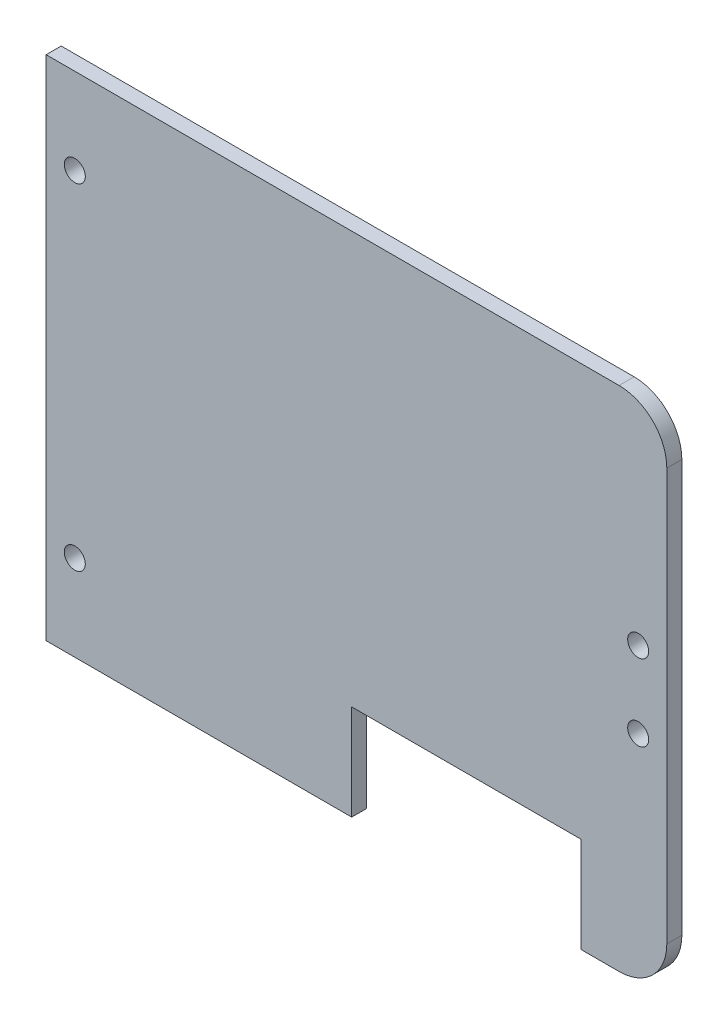
ISO-10303-21;
HEADER;
FILE_DESCRIPTION(('STEP AP214'),'2;1');
FILE_NAME('part.step','',(''),(''),'','','');
FILE_SCHEMA(('AUTOMOTIVE_DESIGN { 1 0 10303 214 1 1 1 1 }'));
ENDSEC;
DATA;
#1=APPLICATION_CONTEXT('core data for automotive mechanical design processes');
#2=APPLICATION_PROTOCOL_DEFINITION('international standard','automotive_design',2000,#1);
#3=PRODUCT_CONTEXT('',#1,'mechanical');
#4=PRODUCT('Part','Part','',(#3));
#5=PRODUCT_RELATED_PRODUCT_CATEGORY('part','',(#4));
#6=PRODUCT_DEFINITION_FORMATION('','',#4);
#7=PRODUCT_DEFINITION_CONTEXT('part definition',#1,'design');
#8=PRODUCT_DEFINITION('design','',#6,#7);
#9=PRODUCT_DEFINITION_SHAPE('','',#8);
#10=(LENGTH_UNIT() NAMED_UNIT(*) SI_UNIT(.MILLI.,.METRE.));
#11=(NAMED_UNIT(*) PLANE_ANGLE_UNIT() SI_UNIT($,.RADIAN.));
#12=(NAMED_UNIT(*) SI_UNIT($,.STERADIAN.) SOLID_ANGLE_UNIT());
#13=UNCERTAINTY_MEASURE_WITH_UNIT(LENGTH_MEASURE(1.E-05),#10,'distance_accuracy_value','');
#14=(GEOMETRIC_REPRESENTATION_CONTEXT(3) GLOBAL_UNCERTAINTY_ASSIGNED_CONTEXT((#13)) GLOBAL_UNIT_ASSIGNED_CONTEXT((#10,
#11,#12)) REPRESENTATION_CONTEXT('',''));
#15=CARTESIAN_POINT('',(0.,0.,0.));
#16=DIRECTION('',(0.,0.,1.));
#17=DIRECTION('',(1.,0.,0.));
#18=AXIS2_PLACEMENT_3D('',#15,#16,#17);
#19=CARTESIAN_POINT('',(60.,48.15,-1.5748));
#20=DIRECTION('',(0.,0.,1.));
#21=DIRECTION('',(1.,0.,0.));
#22=AXIS2_PLACEMENT_3D('',#19,#20,#21);
#23=CYLINDRICAL_SURFACE('',#22,5.);
#24=CARTESIAN_POINT('',(60.,48.15,0.));
#25=DIRECTION('',(0.,0.,1.));
#26=DIRECTION('',(1.,0.,0.));
#27=AXIS2_PLACEMENT_3D('',#24,#25,#26);
#28=CIRCLE('',#27,5.);
#29=CARTESIAN_POINT('',(65.,48.15,0.));
#30=VERTEX_POINT('',#29);
#31=CARTESIAN_POINT('',(60.,53.15,0.));
#32=VERTEX_POINT('',#31);
#33=EDGE_CURVE('E161',#30,#32,#28,.T.);
#34=ORIENTED_EDGE('',*,*,#33,.F.);
#35=DIRECTION('',(0.,0.,1.));
#36=VECTOR('',#35,1.);
#37=CARTESIAN_POINT('',(65.,48.15,-1.5748));
#38=LINE('',#37,#36);
#39=CARTESIAN_POINT('',(65.,48.15,-1.5748));
#40=VERTEX_POINT('',#39);
#41=EDGE_CURVE('E11',#40,#30,#38,.T.);
#42=ORIENTED_EDGE('',*,*,#41,.F.);
#43=CARTESIAN_POINT('',(60.,48.15,-1.5748));
#44=DIRECTION('',(0.,0.,1.));
#45=DIRECTION('',(1.,0.,0.));
#46=AXIS2_PLACEMENT_3D('',#43,#44,#45);
#47=CIRCLE('',#46,5.);
#48=CARTESIAN_POINT('',(60.,53.15,-1.5748));
#49=VERTEX_POINT('',#48);
#50=EDGE_CURVE('E197',#40,#49,#47,.T.);
#51=ORIENTED_EDGE('',*,*,#50,.T.);
#52=DIRECTION('',(0.,0.,1.));
#53=VECTOR('',#52,1.);
#54=CARTESIAN_POINT('',(60.,53.15,-1.5748));
#55=LINE('',#54,#53);
#56=EDGE_CURVE('E48',#49,#32,#55,.T.);
#57=ORIENTED_EDGE('',*,*,#56,.T.);
#58=EDGE_LOOP('',(#34,#42,#51,#57));
#59=FACE_BOUND('',#58,.T.);
#60=ADVANCED_FACE('F45',(#59),#23,.T.);
#61=CARTESIAN_POINT('',(65.,48.15,-1.5748));
#62=DIRECTION('',(1.,0.,0.));
#63=DIRECTION('',(0.,0.,-1.));
#64=AXIS2_PLACEMENT_3D('',#61,#62,#63);
#65=PLANE('',#64);
#66=DIRECTION('',(0.,1.,0.));
#67=VECTOR('',#66,1.);
#68=CARTESIAN_POINT('',(65.,48.15,0.));
#69=LINE('',#68,#67);
#70=CARTESIAN_POINT('',(65.,5.,0.));
#71=VERTEX_POINT('',#70);
#72=EDGE_CURVE('E194',#71,#30,#69,.T.);
#73=ORIENTED_EDGE('',*,*,#72,.F.);
#74=DIRECTION('',(0.,0.,1.));
#75=VECTOR('',#74,1.);
#76=CARTESIAN_POINT('',(65.,5.,-1.5748));
#77=LINE('',#76,#75);
#78=CARTESIAN_POINT('',(65.,5.,-1.5748));
#79=VERTEX_POINT('',#78);
#80=EDGE_CURVE('E55',#79,#71,#77,.T.);
#81=ORIENTED_EDGE('',*,*,#80,.F.);
#82=DIRECTION('',(0.,1.,0.));
#83=VECTOR('',#82,1.);
#84=CARTESIAN_POINT('',(65.,48.15,-1.5748));
#85=LINE('',#84,#83);
#86=EDGE_CURVE('E146',#79,#40,#85,.T.);
#87=ORIENTED_EDGE('',*,*,#86,.T.);
#88=ORIENTED_EDGE('',*,*,#41,.T.);
#89=EDGE_LOOP('',(#73,#81,#87,#88));
#90=FACE_BOUND('',#89,.T.);
#91=ADVANCED_FACE('F222',(#90),#65,.T.);
#92=CARTESIAN_POINT('',(60.,5.,-1.5748));
#93=DIRECTION('',(0.,0.,1.));
#94=DIRECTION('',(1.,0.,0.));
#95=AXIS2_PLACEMENT_3D('',#92,#93,#94);
#96=CYLINDRICAL_SURFACE('',#95,5.);
#97=CARTESIAN_POINT('',(60.,5.,0.));
#98=DIRECTION('',(0.,0.,1.));
#99=DIRECTION('',(1.,0.,0.));
#100=AXIS2_PLACEMENT_3D('',#97,#98,#99);
#101=CIRCLE('',#100,5.);
#102=CARTESIAN_POINT('',(60.,0.,0.));
#103=VERTEX_POINT('',#102);
#104=EDGE_CURVE('E132',#103,#71,#101,.T.);
#105=ORIENTED_EDGE('',*,*,#104,.F.);
#106=DIRECTION('',(0.,0.,1.));
#107=VECTOR('',#106,1.);
#108=CARTESIAN_POINT('',(60.,0.,-1.5748));
#109=LINE('',#108,#107);
#110=CARTESIAN_POINT('',(60.,0.,-1.5748));
#111=VERTEX_POINT('',#110);
#112=EDGE_CURVE('E127',#111,#103,#109,.T.);
#113=ORIENTED_EDGE('',*,*,#112,.F.);
#114=CARTESIAN_POINT('',(60.,5.,-1.5748));
#115=DIRECTION('',(0.,0.,1.));
#116=DIRECTION('',(1.,0.,0.));
#117=AXIS2_PLACEMENT_3D('',#114,#115,#116);
#118=CIRCLE('',#117,5.);
#119=EDGE_CURVE('E130',#111,#79,#118,.T.);
#120=ORIENTED_EDGE('',*,*,#119,.T.);
#121=ORIENTED_EDGE('',*,*,#80,.T.);
#122=EDGE_LOOP('',(#105,#113,#120,#121));
#123=FACE_BOUND('',#122,.T.);
#124=ADVANCED_FACE('F129',(#123),#96,.T.);
#125=CARTESIAN_POINT('',(60.,0.,-1.5748));
#126=DIRECTION('',(0.,-1.,0.));
#127=DIRECTION('',(0.,0.,-1.));
#128=AXIS2_PLACEMENT_3D('',#125,#126,#127);
#129=PLANE('',#128);
#130=DIRECTION('',(1.,0.,0.));
#131=VECTOR('',#130,1.);
#132=CARTESIAN_POINT('',(60.,0.,0.));
#133=LINE('',#132,#131);
#134=CARTESIAN_POINT('',(56.,0.,0.));
#135=VERTEX_POINT('',#134);
#136=EDGE_CURVE('E189',#135,#103,#133,.T.);
#137=ORIENTED_EDGE('',*,*,#136,.F.);
#138=DIRECTION('',(0.,0.,1.));
#139=VECTOR('',#138,1.);
#140=CARTESIAN_POINT('',(56.,0.,-1.5748));
#141=LINE('',#140,#139);
#142=CARTESIAN_POINT('',(56.,0.,-1.5748));
#143=VERTEX_POINT('',#142);
#144=EDGE_CURVE('E138',#143,#135,#141,.T.);
#145=ORIENTED_EDGE('',*,*,#144,.F.);
#146=DIRECTION('',(1.,0.,0.));
#147=VECTOR('',#146,1.);
#148=CARTESIAN_POINT('',(60.,0.,-1.5748));
#149=LINE('',#148,#147);
#150=EDGE_CURVE('E144',#143,#111,#149,.T.);
#151=ORIENTED_EDGE('',*,*,#150,.T.);
#152=ORIENTED_EDGE('',*,*,#112,.T.);
#153=EDGE_LOOP('',(#137,#145,#151,#152));
#154=FACE_BOUND('',#153,.T.);
#155=ADVANCED_FACE('F149',(#154),#129,.T.);
#156=CARTESIAN_POINT('',(56.,0.,-1.5748));
#157=DIRECTION('',(-1.,0.,0.));
#158=DIRECTION('',(0.,0.,1.));
#159=AXIS2_PLACEMENT_3D('',#156,#157,#158);
#160=PLANE('',#159);
#161=DIRECTION('',(0.,-1.,0.));
#162=VECTOR('',#161,1.);
#163=CARTESIAN_POINT('',(56.,0.,0.));
#164=LINE('',#163,#162);
#165=CARTESIAN_POINT('',(56.,10.,0.));
#166=VERTEX_POINT('',#165);
#167=EDGE_CURVE('E186',#166,#135,#164,.T.);
#168=ORIENTED_EDGE('',*,*,#167,.F.);
#169=DIRECTION('',(0.,0.,1.));
#170=VECTOR('',#169,1.);
#171=CARTESIAN_POINT('',(56.,10.,-1.5748));
#172=LINE('',#171,#170);
#173=CARTESIAN_POINT('',(56.,10.,-1.5748));
#174=VERTEX_POINT('',#173);
#175=EDGE_CURVE('E203',#174,#166,#172,.T.);
#176=ORIENTED_EDGE('',*,*,#175,.F.);
#177=DIRECTION('',(0.,-1.,0.));
#178=VECTOR('',#177,1.);
#179=CARTESIAN_POINT('',(56.,0.,-1.5748));
#180=LINE('',#179,#178);
#181=EDGE_CURVE('E151',#174,#143,#180,.T.);
#182=ORIENTED_EDGE('',*,*,#181,.T.);
#183=ORIENTED_EDGE('',*,*,#144,.T.);
#184=EDGE_LOOP('',(#168,#176,#182,#183));
#185=FACE_BOUND('',#184,.T.);
#186=ADVANCED_FACE('F235',(#185),#160,.T.);
#187=CARTESIAN_POINT('',(56.,10.,-1.5748));
#188=DIRECTION('',(0.,-1.,0.));
#189=DIRECTION('',(0.,0.,-1.));
#190=AXIS2_PLACEMENT_3D('',#187,#188,#189);
#191=PLANE('',#190);
#192=DIRECTION('',(1.,0.,0.));
#193=VECTOR('',#192,1.);
#194=CARTESIAN_POINT('',(56.,10.,0.));
#195=LINE('',#194,#193);
#196=CARTESIAN_POINT('',(32.,10.,0.));
#197=VERTEX_POINT('',#196);
#198=EDGE_CURVE('E182',#197,#166,#195,.T.);
#199=ORIENTED_EDGE('',*,*,#198,.F.);
#200=DIRECTION('',(0.,0.,1.));
#201=VECTOR('',#200,1.);
#202=CARTESIAN_POINT('',(32.,10.,-1.5748));
#203=LINE('',#202,#201);
#204=CARTESIAN_POINT('',(32.,10.,-1.5748));
#205=VERTEX_POINT('',#204);
#206=EDGE_CURVE('E206',#205,#197,#203,.T.);
#207=ORIENTED_EDGE('',*,*,#206,.F.);
#208=DIRECTION('',(1.,0.,0.));
#209=VECTOR('',#208,1.);
#210=CARTESIAN_POINT('',(56.,10.,-1.5748));
#211=LINE('',#210,#209);
#212=EDGE_CURVE('E156',#205,#174,#211,.T.);
#213=ORIENTED_EDGE('',*,*,#212,.T.);
#214=ORIENTED_EDGE('',*,*,#175,.T.);
#215=EDGE_LOOP('',(#199,#207,#213,#214));
#216=FACE_BOUND('',#215,.T.);
#217=ADVANCED_FACE('F238',(#216),#191,.T.);
#218=CARTESIAN_POINT('',(32.,10.,-1.5748));
#219=DIRECTION('',(1.,0.,0.));
#220=DIRECTION('',(0.,0.,-1.));
#221=AXIS2_PLACEMENT_3D('',#218,#219,#220);
#222=PLANE('',#221);
#223=DIRECTION('',(0.,1.,0.));
#224=VECTOR('',#223,1.);
#225=CARTESIAN_POINT('',(32.,10.,0.));
#226=LINE('',#225,#224);
#227=CARTESIAN_POINT('',(32.,0.,0.));
#228=VERTEX_POINT('',#227);
#229=EDGE_CURVE('E178',#228,#197,#226,.T.);
#230=ORIENTED_EDGE('',*,*,#229,.F.);
#231=DIRECTION('',(0.,0.,1.));
#232=VECTOR('',#231,1.);
#233=CARTESIAN_POINT('',(32.,0.,-1.5748));
#234=LINE('',#233,#232);
#235=CARTESIAN_POINT('',(32.,0.,-1.5748));
#236=VERTEX_POINT('',#235);
#237=EDGE_CURVE('E209',#236,#228,#234,.T.);
#238=ORIENTED_EDGE('',*,*,#237,.F.);
#239=DIRECTION('',(0.,1.,0.));
#240=VECTOR('',#239,1.);
#241=CARTESIAN_POINT('',(32.,10.,-1.5748));
#242=LINE('',#241,#240);
#243=EDGE_CURVE('E329',#236,#205,#242,.T.);
#244=ORIENTED_EDGE('',*,*,#243,.T.);
#245=ORIENTED_EDGE('',*,*,#206,.T.);
#246=EDGE_LOOP('',(#230,#238,#244,#245));
#247=FACE_BOUND('',#246,.T.);
#248=ADVANCED_FACE('F242',(#247),#222,.T.);
#249=CARTESIAN_POINT('',(32.,0.,-1.5748));
#250=DIRECTION('',(0.,-1.,0.));
#251=DIRECTION('',(0.,0.,-1.));
#252=AXIS2_PLACEMENT_3D('',#249,#250,#251);
#253=PLANE('',#252);
#254=DIRECTION('',(1.,0.,0.));
#255=VECTOR('',#254,1.);
#256=CARTESIAN_POINT('',(32.,0.,0.));
#257=LINE('',#256,#255);
#258=CARTESIAN_POINT('',(0.,0.,0.));
#259=VERTEX_POINT('',#258);
#260=EDGE_CURVE('E174',#259,#228,#257,.T.);
#261=ORIENTED_EDGE('',*,*,#260,.F.);
#262=DIRECTION('',(0.,0.,1.));
#263=VECTOR('',#262,1.);
#264=CARTESIAN_POINT('',(0.,0.,-1.5748));
#265=LINE('',#264,#263);
#266=CARTESIAN_POINT('',(0.,0.,-1.5748));
#267=VERTEX_POINT('',#266);
#268=EDGE_CURVE('E212',#267,#259,#265,.T.);
#269=ORIENTED_EDGE('',*,*,#268,.F.);
#270=DIRECTION('',(1.,0.,0.));
#271=VECTOR('',#270,1.);
#272=CARTESIAN_POINT('',(32.,0.,-1.5748));
#273=LINE('',#272,#271);
#274=EDGE_CURVE('E325',#267,#236,#273,.T.);
#275=ORIENTED_EDGE('',*,*,#274,.T.);
#276=ORIENTED_EDGE('',*,*,#237,.T.);
#277=EDGE_LOOP('',(#261,#269,#275,#276));
#278=FACE_BOUND('',#277,.T.);
#279=ADVANCED_FACE('F246',(#278),#253,.T.);
#280=CARTESIAN_POINT('',(0.,0.,-1.5748));
#281=DIRECTION('',(-1.,0.,0.));
#282=DIRECTION('',(0.,0.,1.));
#283=AXIS2_PLACEMENT_3D('',#280,#281,#282);
#284=PLANE('',#283);
#285=DIRECTION('',(0.,-1.,0.));
#286=VECTOR('',#285,1.);
#287=CARTESIAN_POINT('',(0.,0.,0.));
#288=LINE('',#287,#286);
#289=CARTESIAN_POINT('',(0.,53.15,0.));
#290=VERTEX_POINT('',#289);
#291=EDGE_CURVE('E170',#290,#259,#288,.T.);
#292=ORIENTED_EDGE('',*,*,#291,.F.);
#293=DIRECTION('',(0.,0.,1.));
#294=VECTOR('',#293,1.);
#295=CARTESIAN_POINT('',(0.,53.15,-1.5748));
#296=LINE('',#295,#294);
#297=CARTESIAN_POINT('',(0.,53.15,-1.5748));
#298=VERTEX_POINT('',#297);
#299=EDGE_CURVE('E214',#298,#290,#296,.T.);
#300=ORIENTED_EDGE('',*,*,#299,.F.);
#301=DIRECTION('',(0.,-1.,0.));
#302=VECTOR('',#301,1.);
#303=CARTESIAN_POINT('',(0.,0.,-1.5748));
#304=LINE('',#303,#302);
#305=EDGE_CURVE('E321',#298,#267,#304,.T.);
#306=ORIENTED_EDGE('',*,*,#305,.T.);
#307=ORIENTED_EDGE('',*,*,#268,.T.);
#308=EDGE_LOOP('',(#292,#300,#306,#307));
#309=FACE_BOUND('',#308,.T.);
#310=ADVANCED_FACE('F250',(#309),#284,.T.);
#311=CARTESIAN_POINT('',(0.,53.15,-1.5748));
#312=DIRECTION('',(0.,1.,0.));
#313=DIRECTION('',(0.,0.,1.));
#314=AXIS2_PLACEMENT_3D('',#311,#312,#313);
#315=PLANE('',#314);
#316=DIRECTION('',(-1.,0.,0.));
#317=VECTOR('',#316,1.);
#318=CARTESIAN_POINT('',(0.,53.15,0.));
#319=LINE('',#318,#317);
#320=EDGE_CURVE('E165',#32,#290,#319,.T.);
#321=ORIENTED_EDGE('',*,*,#320,.F.);
#322=ORIENTED_EDGE('',*,*,#56,.F.);
#323=DIRECTION('',(-1.,0.,0.));
#324=VECTOR('',#323,1.);
#325=CARTESIAN_POINT('',(0.,53.15,-1.5748));
#326=LINE('',#325,#324);
#327=EDGE_CURVE('E318',#49,#298,#326,.T.);
#328=ORIENTED_EDGE('',*,*,#327,.T.);
#329=ORIENTED_EDGE('',*,*,#299,.T.);
#330=EDGE_LOOP('',(#321,#322,#328,#329));
#331=FACE_BOUND('',#330,.T.);
#332=ADVANCED_FACE('F219',(#331),#315,.T.);
#333=CARTESIAN_POINT('',(60.,48.15,-1.5748));
#334=DIRECTION('',(0.,0.,1.));
#335=DIRECTION('',(1.,0.,0.));
#336=AXIS2_PLACEMENT_3D('',#333,#334,#335);
#337=PLANE('',#336);
#338=CARTESIAN_POINT('',(62.,30.575,-1.5748));
#339=DIRECTION('',(0.,0.,1.));
#340=DIRECTION('',(1.,0.,0.));
#341=AXIS2_PLACEMENT_3D('',#338,#339,#340);
#342=CIRCLE('',#341,1.1);
#343=CARTESIAN_POINT('',(63.1,30.575,-1.5748));
#344=VERTEX_POINT('',#343);
#345=EDGE_CURVE('E285',#344,#344,#342,.T.);
#346=ORIENTED_EDGE('',*,*,#345,.T.);
#347=EDGE_LOOP('',(#346));
#348=FACE_BOUND('',#347,.T.);
#349=CARTESIAN_POINT('',(3.,44.15,-1.5748));
#350=DIRECTION('',(0.,0.,1.));
#351=DIRECTION('',(1.,0.,0.));
#352=AXIS2_PLACEMENT_3D('',#349,#350,#351);
#353=CIRCLE('',#352,1.1);
#354=CARTESIAN_POINT('',(4.1,44.15,-1.5748));
#355=VERTEX_POINT('',#354);
#356=EDGE_CURVE('E295',#355,#355,#353,.T.);
#357=ORIENTED_EDGE('',*,*,#356,.T.);
#358=EDGE_LOOP('',(#357));
#359=FACE_BOUND('',#358,.T.);
#360=CARTESIAN_POINT('',(62.,22.575,-1.5748));
#361=DIRECTION('',(0.,0.,1.));
#362=DIRECTION('',(1.,0.,0.));
#363=AXIS2_PLACEMENT_3D('',#360,#361,#362);
#364=CIRCLE('',#363,1.1);
#365=CARTESIAN_POINT('',(63.1,22.575,-1.5748));
#366=VERTEX_POINT('',#365);
#367=EDGE_CURVE('E303',#366,#366,#364,.T.);
#368=ORIENTED_EDGE('',*,*,#367,.T.);
#369=EDGE_LOOP('',(#368));
#370=FACE_BOUND('',#369,.T.);
#371=CARTESIAN_POINT('',(3.,9.,-1.5748));
#372=DIRECTION('',(0.,0.,1.));
#373=DIRECTION('',(1.,0.,0.));
#374=AXIS2_PLACEMENT_3D('',#371,#372,#373);
#375=CIRCLE('',#374,1.1);
#376=CARTESIAN_POINT('',(4.1,9.,-1.5748));
#377=VERTEX_POINT('',#376);
#378=EDGE_CURVE('E166',#377,#377,#375,.T.);
#379=ORIENTED_EDGE('',*,*,#378,.T.);
#380=EDGE_LOOP('',(#379));
#381=FACE_BOUND('',#380,.T.);
#382=ORIENTED_EDGE('',*,*,#50,.F.);
#383=ORIENTED_EDGE('',*,*,#86,.F.);
#384=ORIENTED_EDGE('',*,*,#119,.F.);
#385=ORIENTED_EDGE('',*,*,#150,.F.);
#386=ORIENTED_EDGE('',*,*,#181,.F.);
#387=ORIENTED_EDGE('',*,*,#212,.F.);
#388=ORIENTED_EDGE('',*,*,#243,.F.);
#389=ORIENTED_EDGE('',*,*,#274,.F.);
#390=ORIENTED_EDGE('',*,*,#305,.F.);
#391=ORIENTED_EDGE('',*,*,#327,.F.);
#392=EDGE_LOOP('',(#382,#383,#384,#385,#386,#387,#388,#389,#390,#391));
#393=FACE_BOUND('',#392,.T.);
#394=ADVANCED_FACE('F142',(#348,#359,#370,#381,#393),#337,.F.);
#395=CARTESIAN_POINT('',(60.,48.15,0.));
#396=DIRECTION('',(0.,0.,1.));
#397=DIRECTION('',(1.,0.,0.));
#398=AXIS2_PLACEMENT_3D('',#395,#396,#397);
#399=PLANE('',#398);
#400=CARTESIAN_POINT('',(62.,30.575,0.));
#401=DIRECTION('',(0.,0.,1.));
#402=DIRECTION('',(1.,0.,0.));
#403=AXIS2_PLACEMENT_3D('',#400,#401,#402);
#404=CIRCLE('',#403,1.1);
#405=CARTESIAN_POINT('',(63.1,30.575,0.));
#406=VERTEX_POINT('',#405);
#407=EDGE_CURVE('E288',#406,#406,#404,.T.);
#408=ORIENTED_EDGE('',*,*,#407,.F.);
#409=EDGE_LOOP('',(#408));
#410=FACE_BOUND('',#409,.T.);
#411=CARTESIAN_POINT('',(3.,44.15,0.));
#412=DIRECTION('',(0.,0.,1.));
#413=DIRECTION('',(1.,0.,0.));
#414=AXIS2_PLACEMENT_3D('',#411,#412,#413);
#415=CIRCLE('',#414,1.1);
#416=CARTESIAN_POINT('',(4.1,44.15,0.));
#417=VERTEX_POINT('',#416);
#418=EDGE_CURVE('E292',#417,#417,#415,.T.);
#419=ORIENTED_EDGE('',*,*,#418,.F.);
#420=EDGE_LOOP('',(#419));
#421=FACE_BOUND('',#420,.T.);
#422=CARTESIAN_POINT('',(62.,22.575,0.));
#423=DIRECTION('',(0.,0.,1.));
#424=DIRECTION('',(1.,0.,0.));
#425=AXIS2_PLACEMENT_3D('',#422,#423,#424);
#426=CIRCLE('',#425,1.1);
#427=CARTESIAN_POINT('',(63.1,22.575,0.));
#428=VERTEX_POINT('',#427);
#429=EDGE_CURVE('E299',#428,#428,#426,.T.);
#430=ORIENTED_EDGE('',*,*,#429,.F.);
#431=EDGE_LOOP('',(#430));
#432=FACE_BOUND('',#431,.T.);
#433=CARTESIAN_POINT('',(3.,9.,0.));
#434=DIRECTION('',(0.,0.,1.));
#435=DIRECTION('',(1.,0.,0.));
#436=AXIS2_PLACEMENT_3D('',#433,#434,#435);
#437=CIRCLE('',#436,1.1);
#438=CARTESIAN_POINT('',(4.1,9.,0.));
#439=VERTEX_POINT('',#438);
#440=EDGE_CURVE('E307',#439,#439,#437,.T.);
#441=ORIENTED_EDGE('',*,*,#440,.F.);
#442=EDGE_LOOP('',(#441));
#443=FACE_BOUND('',#442,.T.);
#444=ORIENTED_EDGE('',*,*,#33,.T.);
#445=ORIENTED_EDGE('',*,*,#320,.T.);
#446=ORIENTED_EDGE('',*,*,#291,.T.);
#447=ORIENTED_EDGE('',*,*,#260,.T.);
#448=ORIENTED_EDGE('',*,*,#229,.T.);
#449=ORIENTED_EDGE('',*,*,#198,.T.);
#450=ORIENTED_EDGE('',*,*,#167,.T.);
#451=ORIENTED_EDGE('',*,*,#136,.T.);
#452=ORIENTED_EDGE('',*,*,#104,.T.);
#453=ORIENTED_EDGE('',*,*,#72,.T.);
#454=EDGE_LOOP('',(#444,#445,#446,#447,#448,#449,#450,#451,#452,#453));
#455=FACE_BOUND('',#454,.T.);
#456=ADVANCED_FACE('F221',(#410,#421,#432,#443,#455),#399,.T.);
#457=CARTESIAN_POINT('',(3.,9.,-1.5748));
#458=DIRECTION('',(0.,0.,1.));
#459=DIRECTION('',(1.,0.,0.));
#460=AXIS2_PLACEMENT_3D('',#457,#458,#459);
#461=CYLINDRICAL_SURFACE('',#460,1.1);
#462=ORIENTED_EDGE('',*,*,#378,.F.);
#463=EDGE_LOOP('',(#462));
#464=FACE_BOUND('',#463,.T.);
#465=ORIENTED_EDGE('',*,*,#440,.T.);
#466=EDGE_LOOP('',(#465));
#467=FACE_BOUND('',#466,.T.);
#468=ADVANCED_FACE('F262',(#464,#467),#461,.F.);
#469=CARTESIAN_POINT('',(62.,22.575,-1.5748));
#470=DIRECTION('',(0.,0.,1.));
#471=DIRECTION('',(1.,0.,0.));
#472=AXIS2_PLACEMENT_3D('',#469,#470,#471);
#473=CYLINDRICAL_SURFACE('',#472,1.1);
#474=ORIENTED_EDGE('',*,*,#367,.F.);
#475=EDGE_LOOP('',(#474));
#476=FACE_BOUND('',#475,.T.);
#477=ORIENTED_EDGE('',*,*,#429,.T.);
#478=EDGE_LOOP('',(#477));
#479=FACE_BOUND('',#478,.T.);
#480=ADVANCED_FACE('F269',(#476,#479),#473,.F.);
#481=CARTESIAN_POINT('',(3.,44.15,-1.5748));
#482=DIRECTION('',(0.,0.,1.));
#483=DIRECTION('',(1.,0.,0.));
#484=AXIS2_PLACEMENT_3D('',#481,#482,#483);
#485=CYLINDRICAL_SURFACE('',#484,1.1);
#486=ORIENTED_EDGE('',*,*,#356,.F.);
#487=EDGE_LOOP('',(#486));
#488=FACE_BOUND('',#487,.T.);
#489=ORIENTED_EDGE('',*,*,#418,.T.);
#490=EDGE_LOOP('',(#489));
#491=FACE_BOUND('',#490,.T.);
#492=ADVANCED_FACE('F273',(#488,#491),#485,.F.);
#493=CARTESIAN_POINT('',(62.,30.575,-1.5748));
#494=DIRECTION('',(0.,0.,1.));
#495=DIRECTION('',(1.,0.,0.));
#496=AXIS2_PLACEMENT_3D('',#493,#494,#495);
#497=CYLINDRICAL_SURFACE('',#496,1.1);
#498=ORIENTED_EDGE('',*,*,#345,.F.);
#499=EDGE_LOOP('',(#498));
#500=FACE_BOUND('',#499,.T.);
#501=ORIENTED_EDGE('',*,*,#407,.T.);
#502=EDGE_LOOP('',(#501));
#503=FACE_BOUND('',#502,.T.);
#504=ADVANCED_FACE('F277',(#500,#503),#497,.F.);
#505=CLOSED_SHELL('',(#60,#91,#124,#155,#186,#217,#248,#279,#310,#332,#394,#456,#468,#480,#492,#504));
#506=MANIFOLD_SOLID_BREP('B2',#505);
#507=ADVANCED_BREP_SHAPE_REPRESENTATION('',(#18,#506),#14);
#508=SHAPE_DEFINITION_REPRESENTATION(#9,#507);
ENDSEC;
END-ISO-10303-21;
